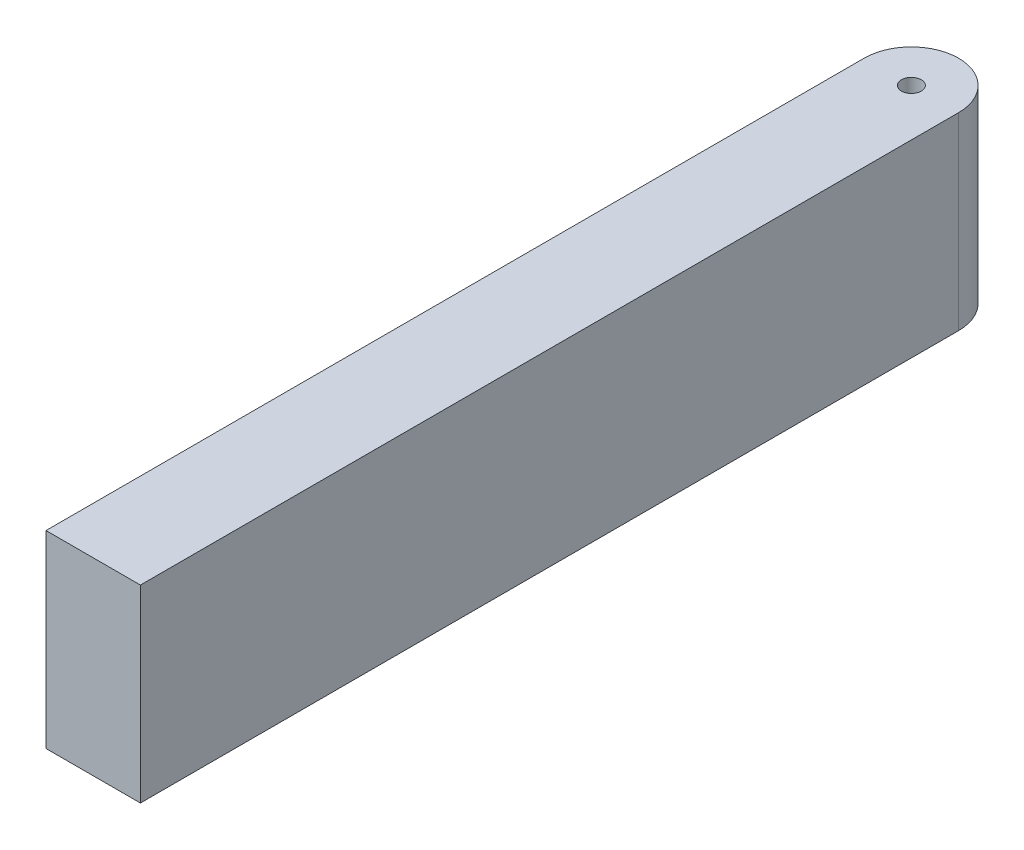
ISO-10303-21;
HEADER;
FILE_DESCRIPTION(('STEP AP214'),'2;1');
FILE_NAME('part.step','',(''),(''),'','','');
FILE_SCHEMA(('AUTOMOTIVE_DESIGN { 1 0 10303 214 1 1 1 1 }'));
ENDSEC;
DATA;
#1=APPLICATION_CONTEXT('core data for automotive mechanical design processes');
#2=APPLICATION_PROTOCOL_DEFINITION('international standard','automotive_design',2000,#1);
#3=PRODUCT_CONTEXT('',#1,'mechanical');
#4=PRODUCT('Part','Part','',(#3));
#5=PRODUCT_RELATED_PRODUCT_CATEGORY('part','',(#4));
#6=PRODUCT_DEFINITION_FORMATION('','',#4);
#7=PRODUCT_DEFINITION_CONTEXT('part definition',#1,'design');
#8=PRODUCT_DEFINITION('design','',#6,#7);
#9=PRODUCT_DEFINITION_SHAPE('','',#8);
#10=(LENGTH_UNIT() NAMED_UNIT(*) SI_UNIT(.MILLI.,.METRE.));
#11=(NAMED_UNIT(*) PLANE_ANGLE_UNIT() SI_UNIT($,.RADIAN.));
#12=(NAMED_UNIT(*) SI_UNIT($,.STERADIAN.) SOLID_ANGLE_UNIT());
#13=UNCERTAINTY_MEASURE_WITH_UNIT(LENGTH_MEASURE(1.E-05),#10,'distance_accuracy_value','');
#14=(GEOMETRIC_REPRESENTATION_CONTEXT(3) GLOBAL_UNCERTAINTY_ASSIGNED_CONTEXT((#13)) GLOBAL_UNIT_ASSIGNED_CONTEXT((#10,
#11,#12)) REPRESENTATION_CONTEXT('',''));
#15=CARTESIAN_POINT('',(0.,0.,0.));
#16=DIRECTION('',(0.,0.,1.));
#17=DIRECTION('',(1.,0.,0.));
#18=AXIS2_PLACEMENT_3D('',#15,#16,#17);
#19=CARTESIAN_POINT('',(19.05,0.,0.));
#20=DIRECTION('',(0.,1.,0.));
#21=DIRECTION('',(-1.,0.,0.));
#22=AXIS2_PLACEMENT_3D('',#19,#20,#21);
#23=CYLINDRICAL_SURFACE('',#22,19.05);
#24=CARTESIAN_POINT('',(19.05,0.,0.));
#25=DIRECTION('',(0.,1.,0.));
#26=DIRECTION('',(-1.,0.,0.));
#27=AXIS2_PLACEMENT_3D('',#24,#25,#26);
#28=CIRCLE('',#27,19.05);
#29=CARTESIAN_POINT('',(38.1,0.,1.33025439009923E-13));
#30=VERTEX_POINT('',#29);
#31=CARTESIAN_POINT('',(0.,0.,0.));
#32=VERTEX_POINT('',#31);
#33=EDGE_CURVE('E11',#30,#32,#28,.T.);
#34=ORIENTED_EDGE('',*,*,#33,.F.);
#35=DIRECTION('',(0.,-1.,0.));
#36=VECTOR('',#35,1.);
#37=CARTESIAN_POINT('',(38.1,-76.2,1.33025439009923E-13));
#38=LINE('',#37,#36);
#39=CARTESIAN_POINT('',(38.1,-76.2,0.));
#40=VERTEX_POINT('',#39);
#41=EDGE_CURVE('E103',#30,#40,#38,.T.);
#42=ORIENTED_EDGE('',*,*,#41,.T.);
#43=CARTESIAN_POINT('',(19.05,-76.2,0.));
#44=DIRECTION('',(0.,1.,0.));
#45=DIRECTION('',(-1.,0.,0.));
#46=AXIS2_PLACEMENT_3D('',#43,#44,#45);
#47=CIRCLE('',#46,19.05);
#48=CARTESIAN_POINT('',(0.,-76.2,0.));
#49=VERTEX_POINT('',#48);
#50=EDGE_CURVE('E41',#40,#49,#47,.T.);
#51=ORIENTED_EDGE('',*,*,#50,.T.);
#52=DIRECTION('',(0.,-1.,0.));
#53=VECTOR('',#52,1.);
#54=CARTESIAN_POINT('',(0.,-76.2,0.));
#55=LINE('',#54,#53);
#56=EDGE_CURVE('E101',#32,#49,#55,.T.);
#57=ORIENTED_EDGE('',*,*,#56,.F.);
#58=EDGE_LOOP('',(#34,#42,#51,#57));
#59=FACE_BOUND('',#58,.T.);
#60=ADVANCED_FACE('F33',(#59),#23,.T.);
#61=CARTESIAN_POINT('',(38.1,0.,1.33025439009923E-13));
#62=DIRECTION('',(0.,1.,0.));
#63=DIRECTION('',(-1.,0.,0.));
#64=AXIS2_PLACEMENT_3D('',#61,#62,#63);
#65=PLANE('',#64);
#66=CARTESIAN_POINT('',(19.05,0.,0.));
#67=DIRECTION('',(0.,1.,0.));
#68=DIRECTION('',(-1.,0.,0.));
#69=AXIS2_PLACEMENT_3D('',#66,#67,#68);
#70=CIRCLE('',#69,3.9878);
#71=CARTESIAN_POINT('',(15.0622,0.,0.));
#72=VERTEX_POINT('',#71);
#73=EDGE_CURVE('E110',#72,#72,#70,.T.);
#74=ORIENTED_EDGE('',*,*,#73,.F.);
#75=EDGE_LOOP('',(#74));
#76=FACE_BOUND('',#75,.T.);
#77=ORIENTED_EDGE('',*,*,#33,.T.);
#78=DIRECTION('',(0.,0.,-1.));
#79=VECTOR('',#78,1.);
#80=CARTESIAN_POINT('',(0.,0.,330.2));
#81=LINE('',#80,#79);
#82=CARTESIAN_POINT('',(0.,0.,330.2));
#83=VERTEX_POINT('',#82);
#84=EDGE_CURVE('E72',#83,#32,#81,.T.);
#85=ORIENTED_EDGE('',*,*,#84,.F.);
#86=DIRECTION('',(-1.,0.,0.));
#87=VECTOR('',#86,1.);
#88=CARTESIAN_POINT('',(0.,0.,330.2));
#89=LINE('',#88,#87);
#90=CARTESIAN_POINT('',(38.1,0.,330.2));
#91=VERTEX_POINT('',#90);
#92=EDGE_CURVE('E55',#91,#83,#89,.T.);
#93=ORIENTED_EDGE('',*,*,#92,.F.);
#94=DIRECTION('',(0.,0.,-1.));
#95=VECTOR('',#94,1.);
#96=CARTESIAN_POINT('',(38.1,0.,330.2));
#97=LINE('',#96,#95);
#98=EDGE_CURVE('E47',#91,#30,#97,.T.);
#99=ORIENTED_EDGE('',*,*,#98,.T.);
#100=EDGE_LOOP('',(#77,#85,#93,#99));
#101=FACE_BOUND('',#100,.T.);
#102=ADVANCED_FACE('F35',(#76,#101),#65,.T.);
#103=CARTESIAN_POINT('',(19.05,-76.2,0.));
#104=DIRECTION('',(0.,-1.,0.));
#105=DIRECTION('',(1.,0.,0.));
#106=AXIS2_PLACEMENT_3D('',#103,#104,#105);
#107=PLANE('',#106);
#108=CARTESIAN_POINT('',(19.05,-76.2,0.));
#109=DIRECTION('',(0.,1.,0.));
#110=DIRECTION('',(-1.,0.,0.));
#111=AXIS2_PLACEMENT_3D('',#108,#109,#110);
#112=CIRCLE('',#111,3.9878);
#113=CARTESIAN_POINT('',(15.0622,-76.2,0.));
#114=VERTEX_POINT('',#113);
#115=EDGE_CURVE('E108',#114,#114,#112,.T.);
#116=ORIENTED_EDGE('',*,*,#115,.T.);
#117=EDGE_LOOP('',(#116));
#118=FACE_BOUND('',#117,.T.);
#119=ORIENTED_EDGE('',*,*,#50,.F.);
#120=DIRECTION('',(0.,0.,-1.));
#121=VECTOR('',#120,1.);
#122=CARTESIAN_POINT('',(38.1,-76.2,330.2));
#123=LINE('',#122,#121);
#124=CARTESIAN_POINT('',(38.1,-76.2,330.2));
#125=VERTEX_POINT('',#124);
#126=EDGE_CURVE('E86',#125,#40,#123,.T.);
#127=ORIENTED_EDGE('',*,*,#126,.F.);
#128=DIRECTION('',(1.,0.,0.));
#129=VECTOR('',#128,1.);
#130=CARTESIAN_POINT('',(0.,-76.2,330.2));
#131=LINE('',#130,#129);
#132=CARTESIAN_POINT('',(0.,-76.2,330.2));
#133=VERTEX_POINT('',#132);
#134=EDGE_CURVE('E78',#133,#125,#131,.T.);
#135=ORIENTED_EDGE('',*,*,#134,.F.);
#136=DIRECTION('',(0.,0.,-1.));
#137=VECTOR('',#136,1.);
#138=CARTESIAN_POINT('',(0.,-76.2,330.2));
#139=LINE('',#138,#137);
#140=EDGE_CURVE('E91',#133,#49,#139,.T.);
#141=ORIENTED_EDGE('',*,*,#140,.T.);
#142=EDGE_LOOP('',(#119,#127,#135,#141));
#143=FACE_BOUND('',#142,.T.);
#144=ADVANCED_FACE('F87',(#118,#143),#107,.T.);
#145=CARTESIAN_POINT('',(0.,0.,330.2));
#146=DIRECTION('',(1.,0.,0.));
#147=DIRECTION('',(0.,0.,-1.));
#148=AXIS2_PLACEMENT_3D('',#145,#146,#147);
#149=PLANE('',#148);
#150=ORIENTED_EDGE('',*,*,#56,.T.);
#151=ORIENTED_EDGE('',*,*,#140,.F.);
#152=DIRECTION('',(0.,-1.,0.));
#153=VECTOR('',#152,1.);
#154=CARTESIAN_POINT('',(0.,0.,330.2));
#155=LINE('',#154,#153);
#156=EDGE_CURVE('E82',#83,#133,#155,.T.);
#157=ORIENTED_EDGE('',*,*,#156,.F.);
#158=ORIENTED_EDGE('',*,*,#84,.T.);
#159=EDGE_LOOP('',(#150,#151,#157,#158));
#160=FACE_BOUND('',#159,.T.);
#161=ADVANCED_FACE('F107',(#160),#149,.F.);
#162=CARTESIAN_POINT('',(38.1,0.,330.2));
#163=DIRECTION('',(-1.,0.,0.));
#164=DIRECTION('',(0.,0.,1.));
#165=AXIS2_PLACEMENT_3D('',#162,#163,#164);
#166=PLANE('',#165);
#167=ORIENTED_EDGE('',*,*,#41,.F.);
#168=ORIENTED_EDGE('',*,*,#98,.F.);
#169=DIRECTION('',(0.,1.,0.));
#170=VECTOR('',#169,1.);
#171=CARTESIAN_POINT('',(38.1,0.,330.2));
#172=LINE('',#171,#170);
#173=EDGE_CURVE('E81',#125,#91,#172,.T.);
#174=ORIENTED_EDGE('',*,*,#173,.F.);
#175=ORIENTED_EDGE('',*,*,#126,.T.);
#176=EDGE_LOOP('',(#167,#168,#174,#175));
#177=FACE_BOUND('',#176,.T.);
#178=ADVANCED_FACE('F93',(#177),#166,.F.);
#179=CARTESIAN_POINT('',(0.,0.,330.2));
#180=DIRECTION('',(0.,0.,1.));
#181=DIRECTION('',(1.,0.,0.));
#182=AXIS2_PLACEMENT_3D('',#179,#180,#181);
#183=PLANE('',#182);
#184=ORIENTED_EDGE('',*,*,#156,.T.);
#185=ORIENTED_EDGE('',*,*,#134,.T.);
#186=ORIENTED_EDGE('',*,*,#173,.T.);
#187=ORIENTED_EDGE('',*,*,#92,.T.);
#188=EDGE_LOOP('',(#184,#185,#186,#187));
#189=FACE_BOUND('',#188,.T.);
#190=ADVANCED_FACE('F79',(#189),#183,.T.);
#191=CARTESIAN_POINT('',(19.05,-76.2,0.));
#192=DIRECTION('',(0.,1.,0.));
#193=DIRECTION('',(-1.,0.,0.));
#194=AXIS2_PLACEMENT_3D('',#191,#192,#193);
#195=CYLINDRICAL_SURFACE('',#194,3.9878);
#196=CARTESIAN_POINT('',(15.0622,-76.2,0.));
#197=CARTESIAN_POINT('',(15.0622,-75.40625,0.));
#198=CARTESIAN_POINT('',(15.0622,-74.6125,0.));
#199=CARTESIAN_POINT('',(15.0622,-73.025,0.));
#200=CARTESIAN_POINT('',(15.0622,-72.23125,0.));
#201=CARTESIAN_POINT('',(15.0622,-70.64375,0.));
#202=CARTESIAN_POINT('',(15.0622,-69.85,0.));
#203=CARTESIAN_POINT('',(15.0622,-68.2625,0.));
#204=CARTESIAN_POINT('',(15.0622,-67.46875,0.));
#205=CARTESIAN_POINT('',(15.0622,-65.88125,0.));
#206=CARTESIAN_POINT('',(15.0622,-65.0875,0.));
#207=CARTESIAN_POINT('',(15.0622,-63.5,0.));
#208=CARTESIAN_POINT('',(15.0622,-62.70625,0.));
#209=CARTESIAN_POINT('',(15.0622,-61.11875,0.));
#210=CARTESIAN_POINT('',(15.0622,-60.325,0.));
#211=CARTESIAN_POINT('',(15.0622,-58.7375,0.));
#212=CARTESIAN_POINT('',(15.0622,-57.94375,0.));
#213=CARTESIAN_POINT('',(15.0622,-56.35625,0.));
#214=CARTESIAN_POINT('',(15.0622,-55.5625,0.));
#215=CARTESIAN_POINT('',(15.0622,-53.975,0.));
#216=CARTESIAN_POINT('',(15.0622,-53.18125,0.));
#217=CARTESIAN_POINT('',(15.0622,-51.59375,0.));
#218=CARTESIAN_POINT('',(15.0622,-50.8,0.));
#219=CARTESIAN_POINT('',(15.0622,-49.2125,0.));
#220=CARTESIAN_POINT('',(15.0622,-48.41875,0.));
#221=CARTESIAN_POINT('',(15.0622,-46.83125,0.));
#222=CARTESIAN_POINT('',(15.0622,-46.0375,0.));
#223=CARTESIAN_POINT('',(15.0622,-44.45,0.));
#224=CARTESIAN_POINT('',(15.0622,-43.65625,0.));
#225=CARTESIAN_POINT('',(15.0622,-42.06875,0.));
#226=CARTESIAN_POINT('',(15.0622,-41.275,0.));
#227=CARTESIAN_POINT('',(15.0622,-39.6875,0.));
#228=CARTESIAN_POINT('',(15.0622,-38.89375,0.));
#229=CARTESIAN_POINT('',(15.0622,-37.30625,0.));
#230=CARTESIAN_POINT('',(15.0622,-36.5125,0.));
#231=CARTESIAN_POINT('',(15.0622,-34.925,0.));
#232=CARTESIAN_POINT('',(15.0622,-34.13125,0.));
#233=CARTESIAN_POINT('',(15.0622,-32.54375,0.));
#234=CARTESIAN_POINT('',(15.0622,-31.75,0.));
#235=CARTESIAN_POINT('',(15.0622,-30.1625,0.));
#236=CARTESIAN_POINT('',(15.0622,-29.36875,0.));
#237=CARTESIAN_POINT('',(15.0622,-27.78125,0.));
#238=CARTESIAN_POINT('',(15.0622,-26.9875,0.));
#239=CARTESIAN_POINT('',(15.0622,-25.4,0.));
#240=CARTESIAN_POINT('',(15.0622,-24.60625,0.));
#241=CARTESIAN_POINT('',(15.0622,-23.01875,0.));
#242=CARTESIAN_POINT('',(15.0622,-22.225,0.));
#243=CARTESIAN_POINT('',(15.0622,-20.6375,0.));
#244=CARTESIAN_POINT('',(15.0622,-19.84375,0.));
#245=CARTESIAN_POINT('',(15.0622,-18.25625,0.));
#246=CARTESIAN_POINT('',(15.0622,-17.4625,0.));
#247=CARTESIAN_POINT('',(15.0622,-15.875,0.));
#248=CARTESIAN_POINT('',(15.0622,-15.08125,0.));
#249=CARTESIAN_POINT('',(15.0622,-13.49375,0.));
#250=CARTESIAN_POINT('',(15.0622,-12.7,0.));
#251=CARTESIAN_POINT('',(15.0622,-11.1125,0.));
#252=CARTESIAN_POINT('',(15.0622,-10.31875,0.));
#253=CARTESIAN_POINT('',(15.0622,-8.73125,0.));
#254=CARTESIAN_POINT('',(15.0622,-7.93750000000001,0.));
#255=CARTESIAN_POINT('',(15.0622,-6.35,0.));
#256=CARTESIAN_POINT('',(15.0622,-5.55625,0.));
#257=CARTESIAN_POINT('',(15.0622,-3.96875,0.));
#258=CARTESIAN_POINT('',(15.0622,-3.175,0.));
#259=CARTESIAN_POINT('',(15.0622,-1.5875,0.));
#260=CARTESIAN_POINT('',(15.0622,-0.793750000000001,0.));
#261=CARTESIAN_POINT('',(15.0622,0.,0.));
#262=B_SPLINE_CURVE_WITH_KNOTS('',3,(#196,#197,#198,#199,#200,#201,#202,#203,#204,#205,#206,
#207,#208,#209,#210,#211,#212,#213,#214,#215,#216,#217,#218,#219,#220,#221,#222,#223,#224,#225,
#226,#227,#228,#229,#230,#231,#232,#233,#234,#235,#236,#237,#238,#239,#240,#241,#242,#243,#244,
#245,#246,#247,#248,#249,#250,#251,#252,#253,#254,#255,#256,#257,#258,#259,#260,#261),
.UNSPECIFIED.,.F.,.F.,(4,2,2,2,2,2,2,2,2,2,2,2,2,2,2,2,2,2,2,2,2,2,2,2,2,2,2,2,2,2,2,2,4),(0.,
2.38125,4.7625,7.14375,9.52500000000001,11.90625,14.2875,16.66875,19.05,21.43125,23.8125,
26.19375,28.575,30.95625,33.3375,35.71875,38.1,40.48125,42.8625,45.24375,47.625,50.00625,
52.3875,54.76875,57.15,59.53125,61.9125,64.29375,66.675,69.05625,71.4375,73.81875,76.2),.UNSPECIFIED.);
#263=EDGE_CURVE('BSEAM116',#114,#72,#262,.T.);
#264=ORIENTED_EDGE('',*,*,#115,.F.);
#265=ORIENTED_EDGE('',*,*,#73,.T.);
#266=ORIENTED_EDGE('',*,*,#263,.T.);
#267=ORIENTED_EDGE('',*,*,#263,.F.);
#268=EDGE_LOOP('',(#264,#266,#265,#267));
#269=FACE_BOUND('',#268,.T.);
#270=ADVANCED_FACE('F116',(#269),#195,.F.);
#271=CLOSED_SHELL('',(#60,#102,#144,#161,#178,#190,#270));
#272=MANIFOLD_SOLID_BREP('B2',#271);
#273=ADVANCED_BREP_SHAPE_REPRESENTATION('',(#18,#272),#14);
#274=SHAPE_DEFINITION_REPRESENTATION(#9,#273);
ENDSEC;
END-ISO-10303-21;
